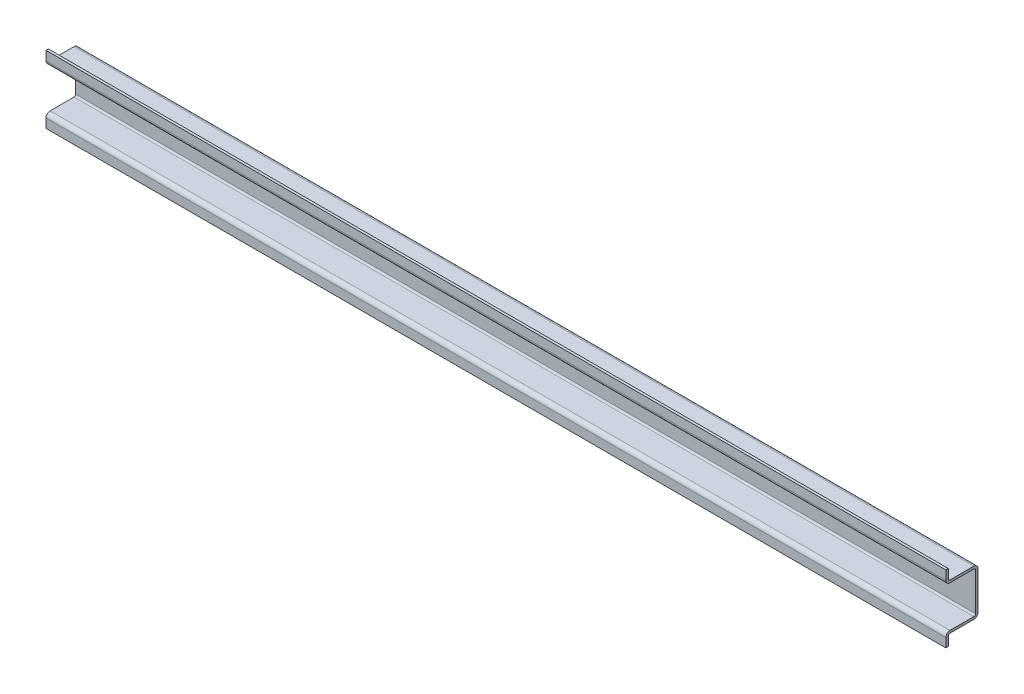
ISO-10303-21;
HEADER;
FILE_DESCRIPTION(('STEP AP214'),'2;1');
FILE_NAME('part.step','',(''),(''),'','','');
FILE_SCHEMA(('AUTOMOTIVE_DESIGN { 1 0 10303 214 1 1 1 1 }'));
ENDSEC;
DATA;
#1=APPLICATION_CONTEXT('core data for automotive mechanical design processes');
#2=APPLICATION_PROTOCOL_DEFINITION('international standard','automotive_design',2000,#1);
#3=PRODUCT_CONTEXT('',#1,'mechanical');
#4=PRODUCT('Part','Part','',(#3));
#5=PRODUCT_RELATED_PRODUCT_CATEGORY('part','',(#4));
#6=PRODUCT_DEFINITION_FORMATION('','',#4);
#7=PRODUCT_DEFINITION_CONTEXT('part definition',#1,'design');
#8=PRODUCT_DEFINITION('design','',#6,#7);
#9=PRODUCT_DEFINITION_SHAPE('','',#8);
#10=(LENGTH_UNIT() NAMED_UNIT(*) SI_UNIT(.MILLI.,.METRE.));
#11=(NAMED_UNIT(*) PLANE_ANGLE_UNIT() SI_UNIT($,.RADIAN.));
#12=(NAMED_UNIT(*) SI_UNIT($,.STERADIAN.) SOLID_ANGLE_UNIT());
#13=UNCERTAINTY_MEASURE_WITH_UNIT(LENGTH_MEASURE(1.E-05),#10,'distance_accuracy_value','');
#14=(GEOMETRIC_REPRESENTATION_CONTEXT(3) GLOBAL_UNCERTAINTY_ASSIGNED_CONTEXT((#13)) GLOBAL_UNIT_ASSIGNED_CONTEXT((#10,
#11,#12)) REPRESENTATION_CONTEXT('',''));
#15=CARTESIAN_POINT('',(0.,0.,0.));
#16=DIRECTION('',(0.,0.,1.));
#17=DIRECTION('',(1.,0.,0.));
#18=AXIS2_PLACEMENT_3D('',#15,#16,#17);
#19=CARTESIAN_POINT('',(273.,-900.000000000001,-18.5));
#20=DIRECTION('',(1.,0.,0.));
#21=DIRECTION('',(0.,0.,-1.));
#22=AXIS2_PLACEMENT_3D('',#19,#20,#21);
#23=PLANE('',#22);
#24=DIRECTION('',(0.,1.,0.));
#25=VECTOR('',#24,1.);
#26=CARTESIAN_POINT('',(273.,-900.000000000001,-1.5));
#27=LINE('',#26,#25);
#28=CARTESIAN_POINT('',(273.,-901.000000000001,-1.5));
#29=VERTEX_POINT('',#28);
#30=CARTESIAN_POINT('',(273.,-906.500000000001,-1.5));
#31=VERTEX_POINT('',#30);
#32=EDGE_CURVE('E213',#29,#31,#27,.F.);
#33=ORIENTED_EDGE('',*,*,#32,.T.);
#34=DIRECTION('',(0.,0.,1.));
#35=VECTOR('',#34,1.);
#36=CARTESIAN_POINT('',(273.,-906.500000000001,-3.));
#37=LINE('',#36,#35);
#38=CARTESIAN_POINT('',(273.,-906.500000000001,-3.));
#39=VERTEX_POINT('',#38);
#40=EDGE_CURVE('E34',#39,#31,#37,.T.);
#41=ORIENTED_EDGE('',*,*,#40,.F.);
#42=DIRECTION('',(0.,1.,0.));
#43=VECTOR('',#42,1.);
#44=CARTESIAN_POINT('',(273.,-900.000000000001,-3.));
#45=LINE('',#44,#43);
#46=CARTESIAN_POINT('',(273.,-901.000000000001,-3.));
#47=VERTEX_POINT('',#46);
#48=EDGE_CURVE('E20',#39,#47,#45,.T.);
#49=ORIENTED_EDGE('',*,*,#48,.T.);
#50=CARTESIAN_POINT('',(273.,-901.000000000001,-4.));
#51=DIRECTION('',(-1.,0.,0.));
#52=DIRECTION('',(0.,0.,1.));
#53=AXIS2_PLACEMENT_3D('',#50,#51,#52);
#54=CIRCLE('',#53,1.);
#55=CARTESIAN_POINT('',(273.,-900.000000000001,-4.));
#56=VERTEX_POINT('',#55);
#57=EDGE_CURVE('E302',#47,#56,#54,.T.);
#58=ORIENTED_EDGE('',*,*,#57,.T.);
#59=DIRECTION('',(0.,0.,-1.));
#60=VECTOR('',#59,1.);
#61=CARTESIAN_POINT('',(273.,-900.000000000001,-18.5));
#62=LINE('',#61,#60);
#63=CARTESIAN_POINT('',(273.,-900.000000000001,-18.5));
#64=VERTEX_POINT('',#63);
#65=EDGE_CURVE('E208',#56,#64,#62,.T.);
#66=ORIENTED_EDGE('',*,*,#65,.T.);
#67=CARTESIAN_POINT('',(273.,-897.500000000001,-18.5));
#68=DIRECTION('',(-1.,0.,0.));
#69=DIRECTION('',(0.,0.,1.));
#70=AXIS2_PLACEMENT_3D('',#67,#68,#69);
#71=CIRCLE('',#70,2.5);
#72=CARTESIAN_POINT('',(273.,-897.500000000001,-21.));
#73=VERTEX_POINT('',#72);
#74=EDGE_CURVE('E210',#64,#73,#71,.F.);
#75=ORIENTED_EDGE('',*,*,#74,.T.);
#76=DIRECTION('',(0.,1.,0.));
#77=VECTOR('',#76,1.);
#78=CARTESIAN_POINT('',(273.,-900.000000000001,-21.));
#79=LINE('',#78,#77);
#80=CARTESIAN_POINT('',(273.,-874.500000000001,-21.));
#81=VERTEX_POINT('',#80);
#82=EDGE_CURVE('E235',#73,#81,#79,.T.);
#83=ORIENTED_EDGE('',*,*,#82,.T.);
#84=CARTESIAN_POINT('',(273.,-874.500000000001,-18.5));
#85=DIRECTION('',(-1.,0.,0.));
#86=DIRECTION('',(0.,0.,1.));
#87=AXIS2_PLACEMENT_3D('',#84,#85,#86);
#88=CIRCLE('',#87,2.5);
#89=CARTESIAN_POINT('',(273.,-872.000000000001,-18.5));
#90=VERTEX_POINT('',#89);
#91=EDGE_CURVE('E234',#81,#90,#88,.F.);
#92=ORIENTED_EDGE('',*,*,#91,.T.);
#93=DIRECTION('',(0.,0.,-1.));
#94=VECTOR('',#93,1.);
#95=CARTESIAN_POINT('',(273.,-872.000000000001,-18.5));
#96=LINE('',#95,#94);
#97=CARTESIAN_POINT('',(273.,-872.000000000001,-4.));
#98=VERTEX_POINT('',#97);
#99=EDGE_CURVE('E229',#90,#98,#96,.F.);
#100=ORIENTED_EDGE('',*,*,#99,.T.);
#101=CARTESIAN_POINT('',(273.,-871.000000000001,-4.));
#102=DIRECTION('',(-1.,0.,0.));
#103=DIRECTION('',(0.,0.,1.));
#104=AXIS2_PLACEMENT_3D('',#101,#102,#103);
#105=CIRCLE('',#104,1.);
#106=CARTESIAN_POINT('',(273.,-871.000000000001,-3.));
#107=VERTEX_POINT('',#106);
#108=EDGE_CURVE('E274',#98,#107,#105,.T.);
#109=ORIENTED_EDGE('',*,*,#108,.T.);
#110=DIRECTION('',(0.,1.,0.));
#111=VECTOR('',#110,1.);
#112=CARTESIAN_POINT('',(273.,-900.000000000001,-3.));
#113=LINE('',#112,#111);
#114=CARTESIAN_POINT('',(273.,-865.500000000001,-3.));
#115=VERTEX_POINT('',#114);
#116=EDGE_CURVE('E226',#107,#115,#113,.T.);
#117=ORIENTED_EDGE('',*,*,#116,.T.);
#118=DIRECTION('',(0.,0.,-1.));
#119=VECTOR('',#118,1.);
#120=CARTESIAN_POINT('',(273.,-865.500000000001,-1.5));
#121=LINE('',#120,#119);
#122=CARTESIAN_POINT('',(273.,-865.500000000001,-1.5));
#123=VERTEX_POINT('',#122);
#124=EDGE_CURVE('E305',#123,#115,#121,.T.);
#125=ORIENTED_EDGE('',*,*,#124,.F.);
#126=DIRECTION('',(0.,1.,0.));
#127=VECTOR('',#126,1.);
#128=CARTESIAN_POINT('',(273.,-900.000000000001,-1.5));
#129=LINE('',#128,#127);
#130=CARTESIAN_POINT('',(273.,-871.000000000001,-1.5));
#131=VERTEX_POINT('',#130);
#132=EDGE_CURVE('E183',#123,#131,#129,.F.);
#133=ORIENTED_EDGE('',*,*,#132,.T.);
#134=CARTESIAN_POINT('',(273.,-871.000000000001,-4.));
#135=DIRECTION('',(-1.,0.,0.));
#136=DIRECTION('',(0.,0.,1.));
#137=AXIS2_PLACEMENT_3D('',#134,#135,#136);
#138=CIRCLE('',#137,2.5);
#139=CARTESIAN_POINT('',(273.,-873.500000000001,-4.));
#140=VERTEX_POINT('',#139);
#141=EDGE_CURVE('E223',#131,#140,#138,.F.);
#142=ORIENTED_EDGE('',*,*,#141,.T.);
#143=DIRECTION('',(0.,0.,-1.));
#144=VECTOR('',#143,1.);
#145=CARTESIAN_POINT('',(273.,-873.500000000001,-18.5));
#146=LINE('',#145,#144);
#147=CARTESIAN_POINT('',(273.,-873.500000000001,-18.5));
#148=VERTEX_POINT('',#147);
#149=EDGE_CURVE('E221',#140,#148,#146,.T.);
#150=ORIENTED_EDGE('',*,*,#149,.T.);
#151=CARTESIAN_POINT('',(273.,-874.500000000001,-18.5));
#152=DIRECTION('',(-1.,0.,0.));
#153=DIRECTION('',(0.,0.,1.));
#154=AXIS2_PLACEMENT_3D('',#151,#152,#153);
#155=CIRCLE('',#154,1.);
#156=CARTESIAN_POINT('',(273.,-874.500000000001,-19.5));
#157=VERTEX_POINT('',#156);
#158=EDGE_CURVE('E198',#148,#157,#155,.T.);
#159=ORIENTED_EDGE('',*,*,#158,.T.);
#160=DIRECTION('',(0.,1.,0.));
#161=VECTOR('',#160,1.);
#162=CARTESIAN_POINT('',(273.,-898.500000000001,-19.5));
#163=LINE('',#162,#161);
#164=CARTESIAN_POINT('',(273.,-897.500000000001,-19.5));
#165=VERTEX_POINT('',#164);
#166=EDGE_CURVE('E202',#165,#157,#163,.T.);
#167=ORIENTED_EDGE('',*,*,#166,.F.);
#168=CARTESIAN_POINT('',(273.,-897.500000000001,-18.5));
#169=DIRECTION('',(-1.,0.,0.));
#170=DIRECTION('',(0.,0.,1.));
#171=AXIS2_PLACEMENT_3D('',#168,#169,#170);
#172=CIRCLE('',#171,1.);
#173=CARTESIAN_POINT('',(273.,-898.500000000001,-18.5));
#174=VERTEX_POINT('',#173);
#175=EDGE_CURVE('E241',#165,#174,#172,.T.);
#176=ORIENTED_EDGE('',*,*,#175,.T.);
#177=DIRECTION('',(0.,0.,-1.));
#178=VECTOR('',#177,1.);
#179=CARTESIAN_POINT('',(273.,-898.500000000001,-18.5));
#180=LINE('',#179,#178);
#181=CARTESIAN_POINT('',(273.,-898.500000000001,-4.));
#182=VERTEX_POINT('',#181);
#183=EDGE_CURVE('E218',#174,#182,#180,.F.);
#184=ORIENTED_EDGE('',*,*,#183,.T.);
#185=CARTESIAN_POINT('',(273.,-901.000000000001,-4.));
#186=DIRECTION('',(-1.,0.,0.));
#187=DIRECTION('',(0.,0.,1.));
#188=AXIS2_PLACEMENT_3D('',#185,#186,#187);
#189=CIRCLE('',#188,2.5);
#190=EDGE_CURVE('E215',#182,#29,#189,.F.);
#191=ORIENTED_EDGE('',*,*,#190,.T.);
#192=EDGE_LOOP('',(#33,#41,#49,#58,#66,#75,#83,#92,#100,#109,#117,#125,#133,#142,#150,#159,#167,
#176,#184,#191));
#193=FACE_BOUND('',#192,.T.);
#194=ADVANCED_FACE('F16',(#193),#23,.T.);
#195=CARTESIAN_POINT('',(-273.,-872.000000000001,-18.5));
#196=DIRECTION('',(-1.,0.,0.));
#197=DIRECTION('',(0.,0.,1.));
#198=AXIS2_PLACEMENT_3D('',#195,#196,#197);
#199=PLANE('',#198);
#200=DIRECTION('',(0.,1.,0.));
#201=VECTOR('',#200,1.);
#202=CARTESIAN_POINT('',(-273.,-872.000000000001,-3.));
#203=LINE('',#202,#201);
#204=CARTESIAN_POINT('',(-273.,-901.000000000001,-3.));
#205=VERTEX_POINT('',#204);
#206=CARTESIAN_POINT('',(-273.,-906.500000000001,-3.));
#207=VERTEX_POINT('',#206);
#208=EDGE_CURVE('E169',#205,#207,#203,.F.);
#209=ORIENTED_EDGE('',*,*,#208,.T.);
#210=DIRECTION('',(0.,0.,-1.));
#211=VECTOR('',#210,1.);
#212=CARTESIAN_POINT('',(-273.,-906.500000000001,-1.5));
#213=LINE('',#212,#211);
#214=CARTESIAN_POINT('',(-273.,-906.500000000001,-1.5));
#215=VERTEX_POINT('',#214);
#216=EDGE_CURVE('E156',#215,#207,#213,.T.);
#217=ORIENTED_EDGE('',*,*,#216,.F.);
#218=DIRECTION('',(0.,1.,0.));
#219=VECTOR('',#218,1.);
#220=CARTESIAN_POINT('',(-273.,-872.000000000001,-1.5));
#221=LINE('',#220,#219);
#222=CARTESIAN_POINT('',(-273.,-901.000000000001,-1.5));
#223=VERTEX_POINT('',#222);
#224=EDGE_CURVE('E166',#215,#223,#221,.T.);
#225=ORIENTED_EDGE('',*,*,#224,.T.);
#226=CARTESIAN_POINT('',(-273.,-901.000000000001,-4.));
#227=DIRECTION('',(-1.,0.,0.));
#228=DIRECTION('',(0.,0.,1.));
#229=AXIS2_PLACEMENT_3D('',#226,#227,#228);
#230=CIRCLE('',#229,2.5);
#231=CARTESIAN_POINT('',(-273.,-898.500000000001,-4.));
#232=VERTEX_POINT('',#231);
#233=EDGE_CURVE('E176',#223,#232,#230,.T.);
#234=ORIENTED_EDGE('',*,*,#233,.T.);
#235=DIRECTION('',(0.,0.,1.));
#236=VECTOR('',#235,1.);
#237=CARTESIAN_POINT('',(-273.,-898.500000000001,-18.5));
#238=LINE('',#237,#236);
#239=CARTESIAN_POINT('',(-273.,-898.500000000001,-18.5));
#240=VERTEX_POINT('',#239);
#241=EDGE_CURVE('E177',#232,#240,#238,.F.);
#242=ORIENTED_EDGE('',*,*,#241,.T.);
#243=CARTESIAN_POINT('',(-273.,-897.500000000001,-18.5));
#244=DIRECTION('',(-1.,0.,0.));
#245=DIRECTION('',(0.,0.,1.));
#246=AXIS2_PLACEMENT_3D('',#243,#244,#245);
#247=CIRCLE('',#246,1.);
#248=CARTESIAN_POINT('',(-273.,-897.500000000001,-19.5));
#249=VERTEX_POINT('',#248);
#250=EDGE_CURVE('E277',#240,#249,#247,.F.);
#251=ORIENTED_EDGE('',*,*,#250,.T.);
#252=DIRECTION('',(0.,1.,0.));
#253=VECTOR('',#252,1.);
#254=CARTESIAN_POINT('',(-273.,-898.500000000001,-19.5));
#255=LINE('',#254,#253);
#256=CARTESIAN_POINT('',(-273.,-874.500000000001,-19.5));
#257=VERTEX_POINT('',#256);
#258=EDGE_CURVE('E26',#257,#249,#255,.F.);
#259=ORIENTED_EDGE('',*,*,#258,.F.);
#260=CARTESIAN_POINT('',(-273.,-874.500000000001,-18.5));
#261=DIRECTION('',(-1.,0.,0.));
#262=DIRECTION('',(0.,0.,1.));
#263=AXIS2_PLACEMENT_3D('',#260,#261,#262);
#264=CIRCLE('',#263,1.);
#265=CARTESIAN_POINT('',(-273.,-873.500000000001,-18.5));
#266=VERTEX_POINT('',#265);
#267=EDGE_CURVE('E287',#257,#266,#264,.F.);
#268=ORIENTED_EDGE('',*,*,#267,.T.);
#269=DIRECTION('',(0.,0.,1.));
#270=VECTOR('',#269,1.);
#271=CARTESIAN_POINT('',(-273.,-873.500000000001,-18.5));
#272=LINE('',#271,#270);
#273=CARTESIAN_POINT('',(-273.,-873.500000000001,-4.));
#274=VERTEX_POINT('',#273);
#275=EDGE_CURVE('E286',#266,#274,#272,.T.);
#276=ORIENTED_EDGE('',*,*,#275,.T.);
#277=CARTESIAN_POINT('',(-273.,-871.000000000001,-4.));
#278=DIRECTION('',(-1.,0.,0.));
#279=DIRECTION('',(0.,0.,1.));
#280=AXIS2_PLACEMENT_3D('',#277,#278,#279);
#281=CIRCLE('',#280,2.5);
#282=CARTESIAN_POINT('',(-273.,-871.000000000001,-1.5));
#283=VERTEX_POINT('',#282);
#284=EDGE_CURVE('E283',#274,#283,#281,.T.);
#285=ORIENTED_EDGE('',*,*,#284,.T.);
#286=DIRECTION('',(0.,1.,0.));
#287=VECTOR('',#286,1.);
#288=CARTESIAN_POINT('',(-273.,-872.000000000001,-1.5));
#289=LINE('',#288,#287);
#290=CARTESIAN_POINT('',(-273.,-865.500000000001,-1.5));
#291=VERTEX_POINT('',#290);
#292=EDGE_CURVE('E285',#283,#291,#289,.T.);
#293=ORIENTED_EDGE('',*,*,#292,.T.);
#294=DIRECTION('',(0.,0.,1.));
#295=VECTOR('',#294,1.);
#296=CARTESIAN_POINT('',(-273.,-865.500000000001,-3.));
#297=LINE('',#296,#295);
#298=CARTESIAN_POINT('',(-273.,-865.500000000001,-3.));
#299=VERTEX_POINT('',#298);
#300=EDGE_CURVE('E332',#299,#291,#297,.T.);
#301=ORIENTED_EDGE('',*,*,#300,.F.);
#302=DIRECTION('',(0.,1.,0.));
#303=VECTOR('',#302,1.);
#304=CARTESIAN_POINT('',(-273.,-872.000000000001,-3.));
#305=LINE('',#304,#303);
#306=CARTESIAN_POINT('',(-273.,-871.000000000001,-3.));
#307=VERTEX_POINT('',#306);
#308=EDGE_CURVE('E306',#299,#307,#305,.F.);
#309=ORIENTED_EDGE('',*,*,#308,.T.);
#310=CARTESIAN_POINT('',(-273.,-871.000000000001,-4.));
#311=DIRECTION('',(-1.,0.,0.));
#312=DIRECTION('',(0.,0.,1.));
#313=AXIS2_PLACEMENT_3D('',#310,#311,#312);
#314=CIRCLE('',#313,1.);
#315=CARTESIAN_POINT('',(-273.,-872.000000000001,-4.));
#316=VERTEX_POINT('',#315);
#317=EDGE_CURVE('E300',#307,#316,#314,.F.);
#318=ORIENTED_EDGE('',*,*,#317,.T.);
#319=DIRECTION('',(0.,0.,1.));
#320=VECTOR('',#319,1.);
#321=CARTESIAN_POINT('',(-273.,-872.000000000001,-18.5));
#322=LINE('',#321,#320);
#323=CARTESIAN_POINT('',(-273.,-872.000000000001,-18.5));
#324=VERTEX_POINT('',#323);
#325=EDGE_CURVE('E282',#316,#324,#322,.F.);
#326=ORIENTED_EDGE('',*,*,#325,.T.);
#327=CARTESIAN_POINT('',(-273.,-874.500000000001,-18.5));
#328=DIRECTION('',(-1.,0.,0.));
#329=DIRECTION('',(0.,0.,1.));
#330=AXIS2_PLACEMENT_3D('',#327,#328,#329);
#331=CIRCLE('',#330,2.5);
#332=CARTESIAN_POINT('',(-273.,-874.500000000001,-21.));
#333=VERTEX_POINT('',#332);
#334=EDGE_CURVE('E279',#324,#333,#331,.T.);
#335=ORIENTED_EDGE('',*,*,#334,.T.);
#336=DIRECTION('',(0.,1.,0.));
#337=VECTOR('',#336,1.);
#338=CARTESIAN_POINT('',(-273.,-872.000000000001,-21.));
#339=LINE('',#338,#337);
#340=CARTESIAN_POINT('',(-273.,-897.500000000001,-21.));
#341=VERTEX_POINT('',#340);
#342=EDGE_CURVE('E195',#333,#341,#339,.F.);
#343=ORIENTED_EDGE('',*,*,#342,.T.);
#344=CARTESIAN_POINT('',(-273.,-897.500000000001,-18.5));
#345=DIRECTION('',(-1.,0.,0.));
#346=DIRECTION('',(0.,0.,1.));
#347=AXIS2_PLACEMENT_3D('',#344,#345,#346);
#348=CIRCLE('',#347,2.5);
#349=CARTESIAN_POINT('',(-273.,-900.000000000001,-18.5));
#350=VERTEX_POINT('',#349);
#351=EDGE_CURVE('E194',#341,#350,#348,.T.);
#352=ORIENTED_EDGE('',*,*,#351,.T.);
#353=DIRECTION('',(0.,0.,1.));
#354=VECTOR('',#353,1.);
#355=CARTESIAN_POINT('',(-273.,-900.000000000001,-18.5));
#356=LINE('',#355,#354);
#357=CARTESIAN_POINT('',(-273.,-900.000000000001,-4.));
#358=VERTEX_POINT('',#357);
#359=EDGE_CURVE('E179',#350,#358,#356,.T.);
#360=ORIENTED_EDGE('',*,*,#359,.T.);
#361=CARTESIAN_POINT('',(-273.,-901.000000000001,-4.));
#362=DIRECTION('',(-1.,0.,0.));
#363=DIRECTION('',(0.,0.,1.));
#364=AXIS2_PLACEMENT_3D('',#361,#362,#363);
#365=CIRCLE('',#364,1.);
#366=EDGE_CURVE('E304',#358,#205,#365,.F.);
#367=ORIENTED_EDGE('',*,*,#366,.T.);
#368=EDGE_LOOP('',(#209,#217,#225,#234,#242,#251,#259,#268,#276,#285,#293,#301,#309,#318,#326,
#335,#343,#352,#360,#367));
#369=FACE_BOUND('',#368,.T.);
#370=ADVANCED_FACE('F165',(#369),#199,.T.);
#371=CARTESIAN_POINT('',(273.,-908.500000000001,-3.));
#372=DIRECTION('',(0.,0.,1.));
#373=DIRECTION('',(1.,0.,0.));
#374=AXIS2_PLACEMENT_3D('',#371,#372,#373);
#375=PLANE('',#374);
#376=DIRECTION('',(1.,0.,0.));
#377=VECTOR('',#376,1.);
#378=CARTESIAN_POINT('',(-273.,-906.500000000001,-3.));
#379=LINE('',#378,#377);
#380=EDGE_CURVE('E170',#207,#39,#379,.T.);
#381=ORIENTED_EDGE('',*,*,#380,.F.);
#382=ORIENTED_EDGE('',*,*,#208,.F.);
#383=DIRECTION('',(1.,0.,0.));
#384=VECTOR('',#383,1.);
#385=CARTESIAN_POINT('',(273.,-901.000000000001,-3.));
#386=LINE('',#385,#384);
#387=EDGE_CURVE('E263',#47,#205,#386,.F.);
#388=ORIENTED_EDGE('',*,*,#387,.F.);
#389=ORIENTED_EDGE('',*,*,#48,.F.);
#390=EDGE_LOOP('',(#381,#382,#388,#389));
#391=FACE_BOUND('',#390,.T.);
#392=ADVANCED_FACE('F368',(#391),#375,.F.);
#393=CARTESIAN_POINT('',(273.,-908.500000000001,-1.5));
#394=DIRECTION('',(0.,0.,1.));
#395=DIRECTION('',(1.,0.,0.));
#396=AXIS2_PLACEMENT_3D('',#393,#394,#395);
#397=PLANE('',#396);
#398=ORIENTED_EDGE('',*,*,#224,.F.);
#399=DIRECTION('',(-1.,0.,0.));
#400=VECTOR('',#399,1.);
#401=CARTESIAN_POINT('',(273.,-906.500000000001,-1.5));
#402=LINE('',#401,#400);
#403=EDGE_CURVE('E153',#31,#215,#402,.T.);
#404=ORIENTED_EDGE('',*,*,#403,.F.);
#405=ORIENTED_EDGE('',*,*,#32,.F.);
#406=DIRECTION('',(-1.,0.,0.));
#407=VECTOR('',#406,1.);
#408=CARTESIAN_POINT('',(273.,-901.000000000001,-1.5));
#409=LINE('',#408,#407);
#410=EDGE_CURVE('E174',#223,#29,#409,.F.);
#411=ORIENTED_EDGE('',*,*,#410,.F.);
#412=EDGE_LOOP('',(#398,#404,#405,#411));
#413=FACE_BOUND('',#412,.T.);
#414=ADVANCED_FACE('F172',(#413),#397,.T.);
#415=CARTESIAN_POINT('',(273.,-873.500000000001,-1.5));
#416=DIRECTION('',(0.,0.,1.));
#417=DIRECTION('',(0.,-1.,0.));
#418=AXIS2_PLACEMENT_3D('',#415,#416,#417);
#419=PLANE('',#418);
#420=ORIENTED_EDGE('',*,*,#132,.F.);
#421=DIRECTION('',(1.,0.,0.));
#422=VECTOR('',#421,1.);
#423=CARTESIAN_POINT('',(-273.,-865.500000000001,-1.5));
#424=LINE('',#423,#422);
#425=EDGE_CURVE('E331',#291,#123,#424,.T.);
#426=ORIENTED_EDGE('',*,*,#425,.F.);
#427=ORIENTED_EDGE('',*,*,#292,.F.);
#428=DIRECTION('',(1.,0.,0.));
#429=VECTOR('',#428,1.);
#430=CARTESIAN_POINT('',(273.,-871.000000000001,-1.5));
#431=LINE('',#430,#429);
#432=EDGE_CURVE('E253',#283,#131,#431,.T.);
#433=ORIENTED_EDGE('',*,*,#432,.T.);
#434=EDGE_LOOP('',(#420,#426,#427,#433));
#435=FACE_BOUND('',#434,.T.);
#436=ADVANCED_FACE('F330',(#435),#419,.T.);
#437=CARTESIAN_POINT('',(273.,-873.500000000001,-3.));
#438=DIRECTION('',(0.,0.,1.));
#439=DIRECTION('',(0.,-1.,0.));
#440=AXIS2_PLACEMENT_3D('',#437,#438,#439);
#441=PLANE('',#440);
#442=DIRECTION('',(-1.,0.,0.));
#443=VECTOR('',#442,1.);
#444=CARTESIAN_POINT('',(273.,-865.500000000001,-3.));
#445=LINE('',#444,#443);
#446=EDGE_CURVE('E42',#115,#299,#445,.T.);
#447=ORIENTED_EDGE('',*,*,#446,.F.);
#448=ORIENTED_EDGE('',*,*,#116,.F.);
#449=DIRECTION('',(1.,0.,0.));
#450=VECTOR('',#449,1.);
#451=CARTESIAN_POINT('',(273.,-871.000000000001,-3.));
#452=LINE('',#451,#450);
#453=EDGE_CURVE('E250',#307,#107,#452,.T.);
#454=ORIENTED_EDGE('',*,*,#453,.F.);
#455=ORIENTED_EDGE('',*,*,#308,.F.);
#456=EDGE_LOOP('',(#447,#448,#454,#455));
#457=FACE_BOUND('',#456,.T.);
#458=ADVANCED_FACE('F338',(#457),#441,.F.);
#459=CARTESIAN_POINT('',(273.,-901.000000000001,-4.));
#460=DIRECTION('',(-1.,0.,0.));
#461=DIRECTION('',(0.,0.,1.));
#462=AXIS2_PLACEMENT_3D('',#459,#460,#461);
#463=CYLINDRICAL_SURFACE('',#462,1.);
#464=ORIENTED_EDGE('',*,*,#57,.F.);
#465=ORIENTED_EDGE('',*,*,#387,.T.);
#466=ORIENTED_EDGE('',*,*,#366,.F.);
#467=DIRECTION('',(1.,0.,0.));
#468=VECTOR('',#467,1.);
#469=CARTESIAN_POINT('',(273.,-900.000000000001,-4.));
#470=LINE('',#469,#468);
#471=EDGE_CURVE('E268',#358,#56,#470,.T.);
#472=ORIENTED_EDGE('',*,*,#471,.T.);
#473=EDGE_LOOP('',(#464,#465,#466,#472));
#474=FACE_BOUND('',#473,.T.);
#475=ADVANCED_FACE('F18',(#474),#463,.F.);
#476=CARTESIAN_POINT('',(273.,-871.000000000001,-4.));
#477=DIRECTION('',(-1.,0.,0.));
#478=DIRECTION('',(0.,0.,1.));
#479=AXIS2_PLACEMENT_3D('',#476,#477,#478);
#480=CYLINDRICAL_SURFACE('',#479,1.);
#481=ORIENTED_EDGE('',*,*,#108,.F.);
#482=DIRECTION('',(1.,0.,0.));
#483=VECTOR('',#482,1.);
#484=CARTESIAN_POINT('',(273.,-872.000000000001,-4.));
#485=LINE('',#484,#483);
#486=EDGE_CURVE('E246',#98,#316,#485,.F.);
#487=ORIENTED_EDGE('',*,*,#486,.T.);
#488=ORIENTED_EDGE('',*,*,#317,.F.);
#489=ORIENTED_EDGE('',*,*,#453,.T.);
#490=EDGE_LOOP('',(#481,#487,#488,#489));
#491=FACE_BOUND('',#490,.T.);
#492=ADVANCED_FACE('F341',(#491),#480,.F.);
#493=CARTESIAN_POINT('',(273.,-898.500000000001,-21.));
#494=DIRECTION('',(0.,0.,1.));
#495=DIRECTION('',(1.,0.,0.));
#496=AXIS2_PLACEMENT_3D('',#493,#494,#495);
#497=PLANE('',#496);
#498=ORIENTED_EDGE('',*,*,#82,.F.);
#499=DIRECTION('',(-1.,0.,0.));
#500=VECTOR('',#499,1.);
#501=CARTESIAN_POINT('',(273.,-897.500000000001,-21.));
#502=LINE('',#501,#500);
#503=EDGE_CURVE('E271',#341,#73,#502,.F.);
#504=ORIENTED_EDGE('',*,*,#503,.F.);
#505=ORIENTED_EDGE('',*,*,#342,.F.);
#506=DIRECTION('',(-1.,0.,0.));
#507=VECTOR('',#506,1.);
#508=CARTESIAN_POINT('',(273.,-874.500000000001,-21.));
#509=LINE('',#508,#507);
#510=EDGE_CURVE('E242',#81,#333,#509,.T.);
#511=ORIENTED_EDGE('',*,*,#510,.F.);
#512=EDGE_LOOP('',(#498,#504,#505,#511));
#513=FACE_BOUND('',#512,.T.);
#514=ADVANCED_FACE('F353',(#513),#497,.F.);
#515=CARTESIAN_POINT('',(273.,-897.500000000001,-18.5));
#516=DIRECTION('',(-1.,0.,0.));
#517=DIRECTION('',(0.,0.,1.));
#518=AXIS2_PLACEMENT_3D('',#515,#516,#517);
#519=CYLINDRICAL_SURFACE('',#518,2.5);
#520=ORIENTED_EDGE('',*,*,#351,.F.);
#521=ORIENTED_EDGE('',*,*,#503,.T.);
#522=ORIENTED_EDGE('',*,*,#74,.F.);
#523=DIRECTION('',(1.,0.,0.));
#524=VECTOR('',#523,1.);
#525=CARTESIAN_POINT('',(273.,-900.000000000001,-18.5));
#526=LINE('',#525,#524);
#527=EDGE_CURVE('E266',#64,#350,#526,.F.);
#528=ORIENTED_EDGE('',*,*,#527,.T.);
#529=EDGE_LOOP('',(#520,#521,#522,#528));
#530=FACE_BOUND('',#529,.T.);
#531=ADVANCED_FACE('F357',(#530),#519,.T.);
#532=CARTESIAN_POINT('',(273.,-900.000000000001,-1.5));
#533=DIRECTION('',(0.,1.,0.));
#534=DIRECTION('',(0.,0.,1.));
#535=AXIS2_PLACEMENT_3D('',#532,#533,#534);
#536=PLANE('',#535);
#537=ORIENTED_EDGE('',*,*,#65,.F.);
#538=ORIENTED_EDGE('',*,*,#471,.F.);
#539=ORIENTED_EDGE('',*,*,#359,.F.);
#540=ORIENTED_EDGE('',*,*,#527,.F.);
#541=EDGE_LOOP('',(#537,#538,#539,#540));
#542=FACE_BOUND('',#541,.T.);
#543=ADVANCED_FACE('F362',(#542),#536,.F.);
#544=CARTESIAN_POINT('',(273.,-901.000000000001,-4.));
#545=DIRECTION('',(-1.,0.,0.));
#546=DIRECTION('',(0.,0.,1.));
#547=AXIS2_PLACEMENT_3D('',#544,#545,#546);
#548=CYLINDRICAL_SURFACE('',#547,2.5);
#549=DIRECTION('',(1.,0.,0.));
#550=VECTOR('',#549,1.);
#551=CARTESIAN_POINT('',(273.,-898.500000000001,-4.));
#552=LINE('',#551,#550);
#553=EDGE_CURVE('E238',#232,#182,#552,.T.);
#554=ORIENTED_EDGE('',*,*,#553,.F.);
#555=ORIENTED_EDGE('',*,*,#233,.F.);
#556=ORIENTED_EDGE('',*,*,#410,.T.);
#557=ORIENTED_EDGE('',*,*,#190,.F.);
#558=EDGE_LOOP('',(#554,#555,#556,#557));
#559=FACE_BOUND('',#558,.T.);
#560=ADVANCED_FACE('F379',(#559),#548,.T.);
#561=CARTESIAN_POINT('',(273.,-873.500000000001,-19.5));
#562=DIRECTION('',(0.,-1.,0.));
#563=DIRECTION('',(0.,0.,-1.));
#564=AXIS2_PLACEMENT_3D('',#561,#562,#563);
#565=PLANE('',#564);
#566=ORIENTED_EDGE('',*,*,#275,.F.);
#567=DIRECTION('',(-1.,0.,0.));
#568=VECTOR('',#567,1.);
#569=CARTESIAN_POINT('',(273.,-873.500000000001,-18.5));
#570=LINE('',#569,#568);
#571=EDGE_CURVE('E259',#266,#148,#570,.F.);
#572=ORIENTED_EDGE('',*,*,#571,.T.);
#573=ORIENTED_EDGE('',*,*,#149,.F.);
#574=DIRECTION('',(-1.,0.,0.));
#575=VECTOR('',#574,1.);
#576=CARTESIAN_POINT('',(273.,-873.500000000001,-4.));
#577=LINE('',#576,#575);
#578=EDGE_CURVE('E256',#274,#140,#577,.F.);
#579=ORIENTED_EDGE('',*,*,#578,.F.);
#580=EDGE_LOOP('',(#566,#572,#573,#579));
#581=FACE_BOUND('',#580,.T.);
#582=ADVANCED_FACE('F321',(#581),#565,.T.);
#583=CARTESIAN_POINT('',(273.,-871.000000000001,-4.));
#584=DIRECTION('',(-1.,0.,0.));
#585=DIRECTION('',(0.,0.,1.));
#586=AXIS2_PLACEMENT_3D('',#583,#584,#585);
#587=CYLINDRICAL_SURFACE('',#586,2.5);
#588=ORIENTED_EDGE('',*,*,#578,.T.);
#589=ORIENTED_EDGE('',*,*,#141,.F.);
#590=ORIENTED_EDGE('',*,*,#432,.F.);
#591=ORIENTED_EDGE('',*,*,#284,.F.);
#592=EDGE_LOOP('',(#588,#589,#590,#591));
#593=FACE_BOUND('',#592,.T.);
#594=ADVANCED_FACE('F325',(#593),#587,.T.);
#595=CARTESIAN_POINT('',(273.,-872.000000000001,-19.5));
#596=DIRECTION('',(0.,-1.,0.));
#597=DIRECTION('',(0.,0.,-1.));
#598=AXIS2_PLACEMENT_3D('',#595,#596,#597);
#599=PLANE('',#598);
#600=ORIENTED_EDGE('',*,*,#99,.F.);
#601=DIRECTION('',(-1.,0.,0.));
#602=VECTOR('',#601,1.);
#603=CARTESIAN_POINT('',(273.,-872.000000000001,-18.5));
#604=LINE('',#603,#602);
#605=EDGE_CURVE('E245',#324,#90,#604,.F.);
#606=ORIENTED_EDGE('',*,*,#605,.F.);
#607=ORIENTED_EDGE('',*,*,#325,.F.);
#608=ORIENTED_EDGE('',*,*,#486,.F.);
#609=EDGE_LOOP('',(#600,#606,#607,#608));
#610=FACE_BOUND('',#609,.T.);
#611=ADVANCED_FACE('F348',(#610),#599,.F.);
#612=CARTESIAN_POINT('',(273.,-874.500000000001,-18.5));
#613=DIRECTION('',(-1.,0.,0.));
#614=DIRECTION('',(0.,0.,1.));
#615=AXIS2_PLACEMENT_3D('',#612,#613,#614);
#616=CYLINDRICAL_SURFACE('',#615,2.5);
#617=ORIENTED_EDGE('',*,*,#334,.F.);
#618=ORIENTED_EDGE('',*,*,#605,.T.);
#619=ORIENTED_EDGE('',*,*,#91,.F.);
#620=ORIENTED_EDGE('',*,*,#510,.T.);
#621=EDGE_LOOP('',(#617,#618,#619,#620));
#622=FACE_BOUND('',#621,.T.);
#623=ADVANCED_FACE('F351',(#622),#616,.T.);
#624=CARTESIAN_POINT('',(273.,-898.500000000001,-1.5));
#625=DIRECTION('',(0.,1.,0.));
#626=DIRECTION('',(0.,0.,1.));
#627=AXIS2_PLACEMENT_3D('',#624,#625,#626);
#628=PLANE('',#627);
#629=ORIENTED_EDGE('',*,*,#241,.F.);
#630=ORIENTED_EDGE('',*,*,#553,.T.);
#631=ORIENTED_EDGE('',*,*,#183,.F.);
#632=DIRECTION('',(-1.,0.,0.));
#633=VECTOR('',#632,1.);
#634=CARTESIAN_POINT('',(273.,-898.500000000001,-18.5));
#635=LINE('',#634,#633);
#636=EDGE_CURVE('E207',#174,#240,#635,.T.);
#637=ORIENTED_EDGE('',*,*,#636,.T.);
#638=EDGE_LOOP('',(#629,#630,#631,#637));
#639=FACE_BOUND('',#638,.T.);
#640=ADVANCED_FACE('F385',(#639),#628,.T.);
#641=CARTESIAN_POINT('',(273.,-874.500000000001,-18.5));
#642=DIRECTION('',(-1.,0.,0.));
#643=DIRECTION('',(0.,0.,1.));
#644=AXIS2_PLACEMENT_3D('',#641,#642,#643);
#645=CYLINDRICAL_SURFACE('',#644,1.);
#646=ORIENTED_EDGE('',*,*,#158,.F.);
#647=ORIENTED_EDGE('',*,*,#571,.F.);
#648=ORIENTED_EDGE('',*,*,#267,.F.);
#649=DIRECTION('',(1.,0.,0.));
#650=VECTOR('',#649,1.);
#651=CARTESIAN_POINT('',(273.,-874.500000000001,-19.5));
#652=LINE('',#651,#650);
#653=EDGE_CURVE('E199',#157,#257,#652,.F.);
#654=ORIENTED_EDGE('',*,*,#653,.F.);
#655=EDGE_LOOP('',(#646,#647,#648,#654));
#656=FACE_BOUND('',#655,.T.);
#657=ADVANCED_FACE('F394',(#656),#645,.F.);
#658=CARTESIAN_POINT('',(273.,-897.500000000001,-18.5));
#659=DIRECTION('',(-1.,0.,0.));
#660=DIRECTION('',(0.,0.,1.));
#661=AXIS2_PLACEMENT_3D('',#658,#659,#660);
#662=CYLINDRICAL_SURFACE('',#661,1.);
#663=ORIENTED_EDGE('',*,*,#175,.F.);
#664=DIRECTION('',(1.,0.,0.));
#665=VECTOR('',#664,1.);
#666=CARTESIAN_POINT('',(273.,-897.500000000001,-19.5));
#667=LINE('',#666,#665);
#668=EDGE_CURVE('E11',#249,#165,#667,.T.);
#669=ORIENTED_EDGE('',*,*,#668,.F.);
#670=ORIENTED_EDGE('',*,*,#250,.F.);
#671=ORIENTED_EDGE('',*,*,#636,.F.);
#672=EDGE_LOOP('',(#663,#669,#670,#671));
#673=FACE_BOUND('',#672,.T.);
#674=ADVANCED_FACE('F388',(#673),#662,.F.);
#675=CARTESIAN_POINT('',(273.,-898.500000000001,-19.5));
#676=DIRECTION('',(0.,0.,1.));
#677=DIRECTION('',(1.,0.,0.));
#678=AXIS2_PLACEMENT_3D('',#675,#676,#677);
#679=PLANE('',#678);
#680=ORIENTED_EDGE('',*,*,#258,.T.);
#681=ORIENTED_EDGE('',*,*,#668,.T.);
#682=ORIENTED_EDGE('',*,*,#166,.T.);
#683=ORIENTED_EDGE('',*,*,#653,.T.);
#684=EDGE_LOOP('',(#680,#681,#682,#683));
#685=FACE_BOUND('',#684,.T.);
#686=ADVANCED_FACE('F390',(#685),#679,.T.);
#687=CARTESIAN_POINT('',(0.,-865.500000000001,0.));
#688=DIRECTION('',(0.,1.,0.));
#689=DIRECTION('',(0.,0.,1.));
#690=AXIS2_PLACEMENT_3D('',#687,#688,#689);
#691=PLANE('',#690);
#692=ORIENTED_EDGE('',*,*,#446,.T.);
#693=ORIENTED_EDGE('',*,*,#300,.T.);
#694=ORIENTED_EDGE('',*,*,#425,.T.);
#695=ORIENTED_EDGE('',*,*,#124,.T.);
#696=EDGE_LOOP('',(#692,#693,#694,#695));
#697=FACE_BOUND('',#696,.T.);
#698=ADVANCED_FACE('F374',(#697),#691,.T.);
#699=CARTESIAN_POINT('',(0.,-906.500000000001,0.));
#700=DIRECTION('',(0.,-1.,0.));
#701=DIRECTION('',(0.,0.,-1.));
#702=AXIS2_PLACEMENT_3D('',#699,#700,#701);
#703=PLANE('',#702);
#704=ORIENTED_EDGE('',*,*,#403,.T.);
#705=ORIENTED_EDGE('',*,*,#216,.T.);
#706=ORIENTED_EDGE('',*,*,#380,.T.);
#707=ORIENTED_EDGE('',*,*,#40,.T.);
#708=EDGE_LOOP('',(#704,#705,#706,#707));
#709=FACE_BOUND('',#708,.T.);
#710=ADVANCED_FACE('F155',(#709),#703,.T.);
#711=CLOSED_SHELL('',(#194,#370,#392,#414,#436,#458,#475,#492,#514,#531,#543,#560,#582,#594,
#611,#623,#640,#657,#674,#686,#698,#710));
#712=MANIFOLD_SOLID_BREP('B1',#711);
#713=ADVANCED_BREP_SHAPE_REPRESENTATION('',(#18,#712),#14);
#714=SHAPE_DEFINITION_REPRESENTATION(#9,#713);
ENDSEC;
END-ISO-10303-21;
